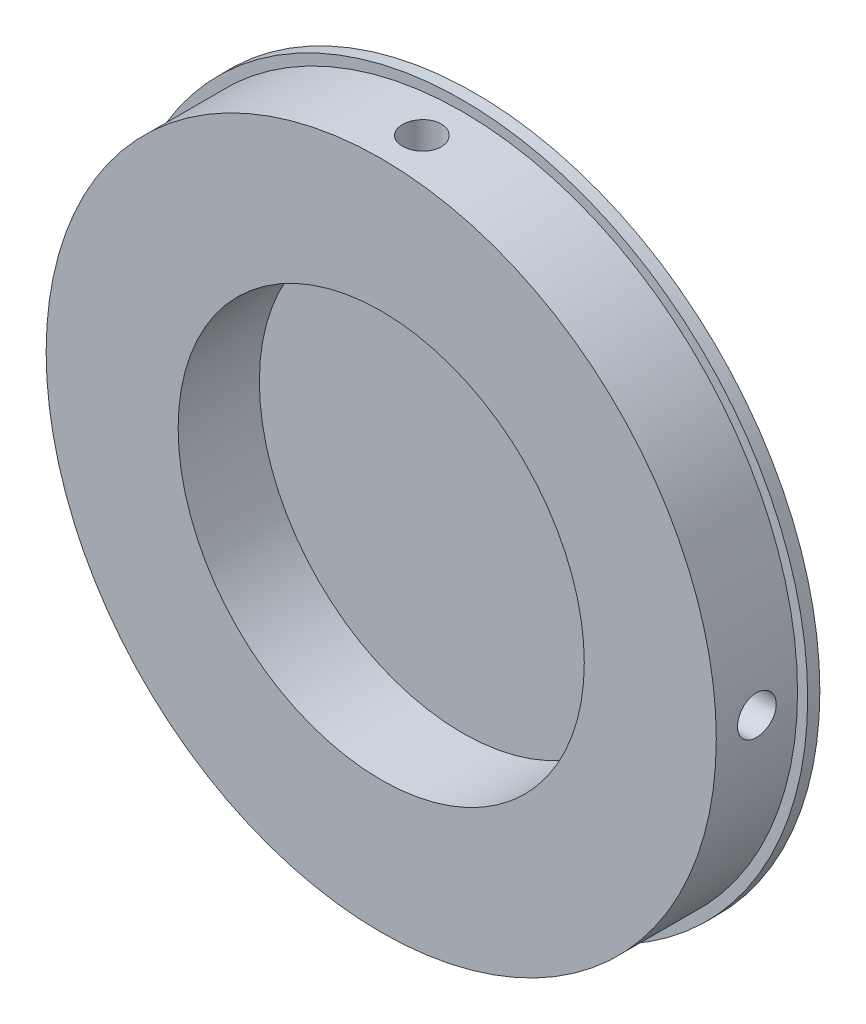
ISO-10303-21;
HEADER;
FILE_DESCRIPTION(('STEP AP214'),'2;1');
FILE_NAME('part.step','',(''),(''),'','','');
FILE_SCHEMA(('AUTOMOTIVE_DESIGN { 1 0 10303 214 1 1 1 1 }'));
ENDSEC;
DATA;
#1=APPLICATION_CONTEXT('core data for automotive mechanical design processes');
#2=APPLICATION_PROTOCOL_DEFINITION('international standard','automotive_design',2000,#1);
#3=PRODUCT_CONTEXT('',#1,'mechanical');
#4=PRODUCT('Part','Part','',(#3));
#5=PRODUCT_RELATED_PRODUCT_CATEGORY('part','',(#4));
#6=PRODUCT_DEFINITION_FORMATION('','',#4);
#7=PRODUCT_DEFINITION_CONTEXT('part definition',#1,'design');
#8=PRODUCT_DEFINITION('design','',#6,#7);
#9=PRODUCT_DEFINITION_SHAPE('','',#8);
#10=(LENGTH_UNIT() NAMED_UNIT(*) SI_UNIT(.MILLI.,.METRE.));
#11=(NAMED_UNIT(*) PLANE_ANGLE_UNIT() SI_UNIT($,.RADIAN.));
#12=(NAMED_UNIT(*) SI_UNIT($,.STERADIAN.) SOLID_ANGLE_UNIT());
#13=UNCERTAINTY_MEASURE_WITH_UNIT(LENGTH_MEASURE(1.E-05),#10,'distance_accuracy_value','');
#14=(GEOMETRIC_REPRESENTATION_CONTEXT(3) GLOBAL_UNCERTAINTY_ASSIGNED_CONTEXT((#13)) GLOBAL_UNIT_ASSIGNED_CONTEXT((#10,
#11,#12)) REPRESENTATION_CONTEXT('',''));
#15=CARTESIAN_POINT('',(0.,0.,0.));
#16=DIRECTION('',(0.,0.,1.));
#17=DIRECTION('',(1.,0.,0.));
#18=AXIS2_PLACEMENT_3D('',#15,#16,#17);
#19=CARTESIAN_POINT('',(0.,0.,23.));
#20=DIRECTION('',(0.,0.,-1.));
#21=DIRECTION('',(-1.,0.,0.));
#22=AXIS2_PLACEMENT_3D('',#19,#20,#21);
#23=CYLINDRICAL_SURFACE('',#22,82.5);
#24=CARTESIAN_POINT('',(82.5,0.,8.23750000000001));
#25=CARTESIAN_POINT('',(82.5000001710466,-0.133684294928125,8.2374989270385));
#26=CARTESIAN_POINT('',(82.4996743884226,-0.267351412059883,8.24313106765356));
#27=CARTESIAN_POINT('',(82.498380723866,-0.533778514118953,8.26561949720516));
#28=CARTESIAN_POINT('',(82.4974126779707,-0.666538258658136,8.2824786522788));
#29=CARTESIAN_POINT('',(82.4948604445486,-0.930274160935514,8.32732352695682));
#30=CARTESIAN_POINT('',(82.493275727431,-1.06124868520879,8.35531881061076));
#31=CARTESIAN_POINT('',(82.4895345059564,-1.3204161729687,8.42224672200215));
#32=CARTESIAN_POINT('',(82.4873777925748,-1.44860810104789,8.46118334834175));
#33=CARTESIAN_POINT('',(82.4825561678019,-1.70113619299289,8.54967120307317));
#34=CARTESIAN_POINT('',(82.4798917099843,-1.82547568389505,8.59921296261874));
#35=CARTESIAN_POINT('',(82.4741277121542,-2.06958227261098,8.70859810030504));
#36=CARTESIAN_POINT('',(82.4710280120698,-2.18934766747147,8.76844527037844));
#37=CARTESIAN_POINT('',(82.4644840005451,-2.42333887528703,8.89796319507606));
#38=CARTESIAN_POINT('',(82.4610398978183,-2.53756798174364,8.96762801040466));
#39=CARTESIAN_POINT('',(82.4539015520487,-2.75979802327165,9.11634151900305));
#40=CARTESIAN_POINT('',(82.4502072170394,-2.86779664118565,9.19539367047744));
#41=CARTESIAN_POINT('',(82.4426710991933,-3.07683796479633,9.36236577898451));
#42=CARTESIAN_POINT('',(82.4388292044479,-3.17787522206015,9.45029255216537));
#43=CARTESIAN_POINT('',(82.4311080535344,-3.37222314004893,9.6343740177568));
#44=CARTESIAN_POINT('',(82.4272287840897,-3.46553093290594,9.73053173743282));
#45=CARTESIAN_POINT('',(82.4195455403245,-3.64368807623651,9.93033345708952));
#46=CARTESIAN_POINT('',(82.4157415417719,-3.72854018556083,10.0339749961518));
#47=CARTESIAN_POINT('',(82.4083140138535,-3.88924887690333,10.2480782742569));
#48=CARTESIAN_POINT('',(82.4046905516244,-3.96510212675093,10.3585425167853));
#49=CARTESIAN_POINT('',(82.3977274142886,-4.10726014156348,10.5855112403982));
#50=CARTESIAN_POINT('',(82.3943878295201,-4.17356187158486,10.7020176254188));
#51=CARTESIAN_POINT('',(82.38808752036,-4.29613809763779,10.9402527551425));
#52=CARTESIAN_POINT('',(82.38512693645,-4.35240887858882,11.0619834140931));
#53=CARTESIAN_POINT('',(82.3796716583502,-4.4544716186685,11.3097276066517));
#54=CARTESIAN_POINT('',(82.377176788938,-4.50026752037841,11.435739508288));
#55=CARTESIAN_POINT('',(82.3727212133632,-4.58109296220072,11.6911930005522));
#56=CARTESIAN_POINT('',(82.3707607044769,-4.61611852670902,11.8206358385212));
#57=CARTESIAN_POINT('',(82.3657772426406,-4.70451119549415,12.2123485263395));
#58=CARTESIAN_POINT('',(82.3636398141681,-4.74142112955763,12.4785547275534));
#59=CARTESIAN_POINT('',(82.3619885494016,-4.77001200898424,13.0132478216944));
#60=CARTESIAN_POINT('',(82.3624746870722,-4.76169340318085,13.2817346919623));
#61=CARTESIAN_POINT('',(82.3660087927303,-4.70016320477401,13.8132058269929));
#62=CARTESIAN_POINT('',(82.369053692345,-4.64700538142023,14.0761962958941));
#63=CARTESIAN_POINT('',(82.3773585193614,-4.49737340952375,14.589504649058));
#64=CARTESIAN_POINT('',(82.382618458442,-4.40089903259367,14.8398224664963));
#65=CARTESIAN_POINT('',(82.3947637873595,-4.1673154923098,15.3208655625796));
#66=CARTESIAN_POINT('',(82.4016501546293,-4.03018188131259,15.5515789457523));
#67=CARTESIAN_POINT('',(82.4162713454365,-3.7191892199578,15.9867305919005));
#68=CARTESIAN_POINT('',(82.4240061770642,-3.54532981939764,16.1911686042945));
#69=CARTESIAN_POINT('',(82.4394661934344,-3.16551794864713,16.5682801441559));
#70=CARTESIAN_POINT('',(82.4471913475306,-2.95951892047617,16.7409067852094));
#71=CARTESIAN_POINT('',(82.4617505086643,-2.52143865140947,17.0491335930679));
#72=CARTESIAN_POINT('',(82.4685845154309,-2.28935740258943,17.1847337486236));
#73=CARTESIAN_POINT('',(82.4805916847322,-1.80567261951349,17.4150542788873));
#74=CARTESIAN_POINT('',(82.4857647774313,-1.55406826493299,17.5097729347322));
#75=CARTESIAN_POINT('',(82.4938661833604,-1.03849186942946,17.6556106878854));
#76=CARTESIAN_POINT('',(82.4967945189649,-0.774519951807292,17.7067302197664));
#77=CARTESIAN_POINT('',(82.5000735323367,-0.242108523461892,17.7638606641558));
#78=CARTESIAN_POINT('',(82.5004279150667,0.0263240081674112,17.769936413208));
#79=CARTESIAN_POINT('',(82.4985289341248,0.560394560649101,17.7369761414025));
#80=CARTESIAN_POINT('',(82.4962755820028,0.826032593873391,17.6979403203491));
#81=CARTESIAN_POINT('',(82.4894172395967,1.3467914103656,17.5759186864281));
#82=CARTESIAN_POINT('',(82.4848138379528,1.60191917285744,17.4929625624052));
#83=CARTESIAN_POINT('',(82.4737734504981,2.09463054485444,17.2854852038291));
#84=CARTESIAN_POINT('',(82.4673364506065,2.3322140196144,17.1609636500819));
#85=CARTESIAN_POINT('',(82.4533432599422,2.78338995773415,16.8737249587525));
#86=CARTESIAN_POINT('',(82.4457858020479,2.99695477124867,16.7109644534331));
#87=CARTESIAN_POINT('',(82.4304067102308,3.39375275622094,16.3519303000184));
#88=CARTESIAN_POINT('',(82.4225850740784,3.57698567159587,16.1556563690081));
#89=CARTESIAN_POINT('',(82.4075484684485,3.90813801387848,15.7348910184093));
#90=CARTESIAN_POINT('',(82.400334227324,4.05601542450035,15.5103665046399));
#91=CARTESIAN_POINT('',(82.3873376850466,4.31197034170699,15.0396268158764));
#92=CARTESIAN_POINT('',(82.3815553761187,4.4200480643946,14.7934117586657));
#93=CARTESIAN_POINT('',(82.3720792838418,4.5932679895823,14.2864841295943));
#94=CARTESIAN_POINT('',(82.3683842076983,4.65843677325907,14.0257806417712));
#95=CARTESIAN_POINT('',(82.3634983407347,4.74405609649354,13.4969645227343));
#96=CARTESIAN_POINT('',(82.3623075294089,4.76450700221352,13.2288519522062));
#97=CARTESIAN_POINT('',(82.362493248935,4.76125982456782,12.8274243206684));
#98=CARTESIAN_POINT('',(82.3628835458103,4.75452808388505,12.6937643963459));
#99=CARTESIAN_POINT('',(82.3643047088927,4.72985116201748,12.4275005222508));
#100=CARTESIAN_POINT('',(82.3653353382203,4.7119101274975,12.294896200341));
#101=CARTESIAN_POINT('',(82.3680094254813,4.66492958825894,12.0316337656578));
#102=CARTESIAN_POINT('',(82.3696531098882,4.63588598195092,11.9009763906948));
#103=CARTESIAN_POINT('',(82.3735054334978,4.56692408620144,11.6426213917837));
#104=CARTESIAN_POINT('',(82.3757138647018,4.5270098001258,11.5149226969854));
#105=CARTESIAN_POINT('',(82.3806342314344,4.43656995482673,11.2632978289156));
#106=CARTESIAN_POINT('',(82.3833463508694,4.38604051891694,11.1393730528745));
#107=CARTESIAN_POINT('',(82.3891954395106,4.27476036443783,10.8962665874364));
#108=CARTESIAN_POINT('',(82.3923322521748,4.21401341005907,10.7770831712181));
#109=CARTESIAN_POINT('',(82.3989437060897,4.08269486275932,10.5442143550357));
#110=CARTESIAN_POINT('',(82.4024184612354,4.01211995409191,10.4305308281339));
#111=CARTESIAN_POINT('',(82.4096051369064,3.86168963781643,10.2095486955213));
#112=CARTESIAN_POINT('',(82.4133169699415,3.78183764497421,10.1022477623176));
#113=CARTESIAN_POINT('',(82.4208804619207,3.61325241572222,9.89456408082421));
#114=CARTESIAN_POINT('',(82.4247323500972,3.52450415924912,9.79419353279118));
#115=CARTESIAN_POINT('',(82.4324592509009,3.33890442803824,9.60131954040531));
#116=CARTESIAN_POINT('',(82.4363342545064,3.24205594422467,9.50881321748823));
#117=CARTESIAN_POINT('',(82.4440013909841,3.0408508222528,9.33222683218342));
#118=CARTESIAN_POINT('',(82.4477934714704,2.93648960702237,9.24815198252806));
#119=CARTESIAN_POINT('',(82.4551834106093,2.72109074436607,9.08911941925441));
#120=CARTESIAN_POINT('',(82.4587813403836,2.61005557370154,9.01415835427129));
#121=CARTESIAN_POINT('',(82.4656876961083,2.38188924289401,8.87374500015392));
#122=CARTESIAN_POINT('',(82.46899568156,2.26474922414926,8.80830708280534));
#123=CARTESIAN_POINT('',(82.4752209249889,2.02540322712018,8.68756351161758));
#124=CARTESIAN_POINT('',(82.478138325583,1.90319911938332,8.63225415673681));
#125=CARTESIAN_POINT('',(82.4834985698215,1.65465879033114,8.53217726443998));
#126=CARTESIAN_POINT('',(82.485941823373,1.52832624951777,8.48740061417585));
#127=CARTESIAN_POINT('',(82.4902870517921,1.2723711862048,8.40865964128221));
#128=CARTESIAN_POINT('',(82.4921891657932,1.14274951873173,8.3746925391208));
#129=CARTESIAN_POINT('',(82.4958304966415,0.845866127826209,8.31014107391986));
#130=CARTESIAN_POINT('',(82.4973882432885,0.677859107368639,8.28292478016678));
#131=CARTESIAN_POINT('',(82.4994728856562,0.339892137737265,8.24660493567703));
#132=CARTESIAN_POINT('',(82.4999997825749,0.169932190833333,8.23750136389021));
#133=CARTESIAN_POINT('',(82.5,0.,8.23750000000001));
#134=B_SPLINE_CURVE_WITH_KNOTS('',3,(#24,#25,#26,#27,#28,#29,#30,#31,#32,#33,#34,#35,#36,#37,
#38,#39,#40,#41,#42,#43,#44,#45,#46,#47,#48,#49,#50,#51,#52,#53,#54,#55,#56,#57,#58,#59,#60,#61,
#62,#63,#64,#65,#66,#67,#68,#69,#70,#71,#72,#73,#74,#75,#76,#77,#78,#79,#80,#81,#82,#83,#84,#85,
#86,#87,#88,#89,#90,#91,#92,#93,#94,#95,#96,#97,#98,#99,#100,#101,#102,#103,#104,#105,#106,#107,
#108,#109,#110,#111,#112,#113,#114,#115,#116,#117,#118,#119,#120,#121,#122,#123,#124,#125,#126,
#127,#128,#129,#130,#131,#132,#133),.UNSPECIFIED.,.T.,.F.,(4,2,2,2,2,2,2,2,2,2,2,2,2,2,2,2,2,2,
2,2,2,2,2,2,2,2,2,2,2,2,2,2,2,2,2,2,2,2,2,2,2,2,2,2,2,2,2,2,2,2,2,2,2,2,4),(0.,
0.400904397878438,0.80191118163131,1.20326310848359,1.60476190383072,2.0059037031414,
2.4071934214326,2.80824140885566,3.20943759954211,3.61094430804965,4.01259932675411,
4.41412286472515,4.81579462106466,5.21759372624662,5.61954133469291,6.02133740645876,
6.42328161378043,7.22540139236237,8.02751321098022,8.82866453696684,9.62982008708939,
10.4314583374919,11.2331042323443,12.0359223753122,12.8387407621929,13.6415929002947,
14.4444370359054,15.2461253235674,16.0478100604717,16.848953572461,17.6501032368248,
18.4521659286345,19.2542353916652,20.0572533437932,20.8602669356606,21.6627826084596,
22.4652917100153,22.8663913222768,23.2673426431569,23.6684422296369,24.0693943016857,
24.470493058051,24.8714443697696,25.2725312832976,25.6734710272792,26.0750994819508,
26.4765802887277,26.8783077990637,27.2798871345309,27.682066361806,28.0840983356916,
28.4857811833331,28.8873606599453,29.3969690762361,29.9065769002728),.UNSPECIFIED.);
#135=CARTESIAN_POINT('',(82.5,0.,8.23750000000001));
#136=VERTEX_POINT('',#135);
#137=EDGE_CURVE('E46',#136,#136,#134,.T.);
#138=ORIENTED_EDGE('',*,*,#137,.T.);
#139=EDGE_LOOP('',(#138));
#140=FACE_BOUND('',#139,.T.);
#141=CARTESIAN_POINT('',(0.,0.,23.));
#142=DIRECTION('',(0.,0.,1.));
#143=DIRECTION('',(1.,0.,0.));
#144=AXIS2_PLACEMENT_3D('',#141,#142,#143);
#145=CIRCLE('',#144,82.5);
#146=CARTESIAN_POINT('',(82.5,0.,23.));
#147=VERTEX_POINT('',#146);
#148=EDGE_CURVE('E96',#147,#147,#145,.T.);
#149=ORIENTED_EDGE('',*,*,#148,.F.);
#150=EDGE_LOOP('',(#149));
#151=FACE_BOUND('',#150,.T.);
#152=CARTESIAN_POINT('',(0.,0.,3.));
#153=DIRECTION('',(0.,0.,1.));
#154=DIRECTION('',(1.,0.,0.));
#155=AXIS2_PLACEMENT_3D('',#152,#153,#154);
#156=CIRCLE('',#155,82.5);
#157=CARTESIAN_POINT('',(82.5,0.,3.));
#158=VERTEX_POINT('',#157);
#159=EDGE_CURVE('E99',#158,#158,#156,.T.);
#160=ORIENTED_EDGE('',*,*,#159,.T.);
#161=EDGE_LOOP('',(#160));
#162=FACE_BOUND('',#161,.T.);
#163=CARTESIAN_POINT('',(-4.7625,82.3624222188129,13.));
#164=CARTESIAN_POINT('',(-4.762501072982,82.3624220466945,13.133684086151));
#165=CARTESIAN_POINT('',(-4.75686894979625,82.3627483769314,13.2673509945762));
#166=CARTESIAN_POINT('',(-4.73438059152569,82.3640441680224,13.5337776736446));
#167=CARTESIAN_POINT('',(-4.71752149028083,82.3650137931044,13.6665372038956));
#168=CARTESIAN_POINT('',(-4.67267676290814,82.3675700413101,13.9302726727845));
#169=CARTESIAN_POINT('',(-4.6446815724611,82.3691571947774,14.0612469778985));
#170=CARTESIAN_POINT('',(-4.57775389109391,82.3729038707627,14.3204140228509));
#171=CARTESIAN_POINT('',(-4.53881740154535,82.37506360252,14.4486057272691));
#172=CARTESIAN_POINT('',(-4.45032987721671,82.3798915011295,14.7011333435737));
#173=CARTESIAN_POINT('',(-4.40078831405232,82.3825592140596,14.8254725834794));
#174=CARTESIAN_POINT('',(-4.29140361675645,82.3883295965517,15.0695786922234));
#175=CARTESIAN_POINT('',(-4.2315566907,82.3914324261392,15.1893438581121));
#176=CARTESIAN_POINT('',(-4.10203929123089,82.3979822157743,15.42333464969));
#177=CARTESIAN_POINT('',(-4.03237475684723,82.4014289674054,15.5375635687226));
#178=CARTESIAN_POINT('',(-3.88366183573261,82.4085718355356,15.7597932879913));
#179=CARTESIAN_POINT('',(-3.80460999080126,82.4122680437145,15.8677917710859));
#180=CARTESIAN_POINT('',(-3.63763818676022,82.4198069358348,16.0768332864262));
#181=CARTESIAN_POINT('',(-3.54971137783866,82.4236497314693,16.1778708433723));
#182=CARTESIAN_POINT('',(-3.36562977739022,82.4313715954747,16.3722193628198));
#183=CARTESIAN_POINT('',(-3.26947195857086,82.43525067672,16.4655274574506));
#184=CARTESIAN_POINT('',(-3.06966998102892,82.4429324753884,16.6436851903452));
#185=CARTESIAN_POINT('',(-2.96602828362459,82.4467352173972,16.7285375878873));
#186=CARTESIAN_POINT('',(-2.75192463052262,82.4541593055628,16.8892468324175));
#187=CARTESIAN_POINT('',(-2.64146017133289,82.4577805842414,16.9651003472464));
#188=CARTESIAN_POINT('',(-2.41449128095738,82.4647386631642,17.107258658225));
#189=CARTESIAN_POINT('',(-2.29798496237056,82.4680753736415,17.1735604457996));
#190=CARTESIAN_POINT('',(-2.05974996176148,82.4743695771217,17.2961367941131));
#191=CARTESIAN_POINT('',(-1.93801936549209,82.4773269295118,17.3524076397773));
#192=CARTESIAN_POINT('',(-1.69027530103267,82.4827757554813,17.4544705144169));
#193=CARTESIAN_POINT('',(-1.56426346467833,82.4852674042653,17.5002664856497));
#194=CARTESIAN_POINT('',(-1.30881011521559,82.4897169062259,17.581092070636));
#195=CARTESIAN_POINT('',(-1.17936735476264,82.491674562261,17.616117708761));
#196=CARTESIAN_POINT('',(-0.787654986145554,82.4966505412326,17.7045105965681));
#197=CARTESIAN_POINT('',(-0.521449054288374,82.4987843994887,17.7414206987917));
#198=CARTESIAN_POINT('',(0.0132435140513982,82.5004329535839,17.7700120075247));
#199=CARTESIAN_POINT('',(0.281730127964765,82.4999476753115,17.7616936610875));
#200=CARTESIAN_POINT('',(0.813202417107879,82.4964193238021,17.7001638695347));
#201=CARTESIAN_POINT('',(1.07619426623097,82.4933792992289,17.647005932711));
#202=CARTESIAN_POINT('',(1.58950532128994,82.4850861007083,17.4973732539409));
#203=CARTESIAN_POINT('',(1.8398244611432,82.4798329152215,17.4008982861409));
#204=CARTESIAN_POINT('',(2.32086914557514,82.467700042399,17.1673135302659));
#205=CARTESIAN_POINT('',(2.55158286237466,82.4608193825595,17.0301794336957));
#206=CARTESIAN_POINT('',(2.98673496909611,82.4462060458133,16.7191857401539));
#207=CARTESIAN_POINT('',(3.19117310822313,82.4384733607755,16.5453257926836));
#208=CARTESIAN_POINT('',(3.56828401622696,82.4230131656624,16.1655135386392));
#209=CARTESIAN_POINT('',(3.74091000951395,82.4152856795933,15.9595147845479));
#210=CARTESIAN_POINT('',(4.04913564169605,82.4007183637725,15.5214352929537));
#211=CARTESIAN_POINT('',(4.18473526803718,82.3938785343217,15.2893545466077));
#212=CARTESIAN_POINT('',(4.41505541929178,82.3818587577336,14.8056698897284));
#213=CARTESIAN_POINT('',(4.50977406019753,82.3766788870986,14.5540650800554));
#214=CARTESIAN_POINT('',(4.65561164357958,82.3685659760135,14.0384876968483));
#215=CARTESIAN_POINT('',(4.70673102332991,82.3656329130292,13.7745152473821));
#216=CARTESIAN_POINT('',(4.76386089548025,82.362348585737,13.2421035874763));
#217=CARTESIAN_POINT('',(4.76993636888256,82.3619936022688,12.973671371685));
#218=CARTESIAN_POINT('',(4.73697565855201,82.3638957528028,12.4396015174497));
#219=CARTESIAN_POINT('',(4.69793967460067,82.3661528752371,12.1739638666348));
#220=CARTESIAN_POINT('',(4.57591810051711,82.3730214641499,11.6532068721928));
#221=CARTESIAN_POINT('',(4.49296236230822,82.377631331409,11.3980805109184));
#222=CARTESIAN_POINT('',(4.28548624563452,82.3886845226781,10.9053717702326));
#223=CARTESIAN_POINT('',(4.16096554571864,82.3951278608674,10.6677895265193));
#224=CARTESIAN_POINT('',(3.87372809719335,82.4091308763189,10.2166144026915));
#225=CARTESIAN_POINT('',(3.71096776363257,82.4166918237407,10.0030493107567));
#226=CARTESIAN_POINT('',(3.35193379596618,82.4320734783217,9.60625068381295));
#227=CARTESIAN_POINT('',(3.1556598802591,82.4398941876633,9.42301740369583));
#228=CARTESIAN_POINT('',(2.73489436544766,82.4549249260856,9.09186430808432));
#229=CARTESIAN_POINT('',(2.51036967042805,82.4621342220343,8.94398651078505));
#230=CARTESIAN_POINT('',(2.0396295193975,82.4751190211247,8.68803091437782));
#231=CARTESIAN_POINT('',(1.79341418118685,82.4808945320525,8.57995289913667));
#232=CARTESIAN_POINT('',(1.2864867577029,82.4903581461651,8.40673277271448));
#233=CARTESIAN_POINT('',(1.0257837996738,82.4940475475924,8.34156395381358));
#234=CARTESIAN_POINT('',(0.496968796425633,82.4989257104748,8.25594437999324));
#235=CARTESIAN_POINT('',(0.228856811426369,82.5001144922485,8.23549326172119));
#236=CARTESIAN_POINT('',(-0.172570741550747,82.4999290947456,8.2387399834581));
#237=CARTESIAN_POINT('',(-0.306231145921063,82.4995394619749,8.24547161560983));
#238=CARTESIAN_POINT('',(-0.572495992997036,82.4981206385866,8.27014840261362));
#239=CARTESIAN_POINT('',(-0.705100807833954,82.4970916844738,8.28808941078106));
#240=CARTESIAN_POINT('',(-0.968364233971281,82.4944217784105,8.33506998251449));
#241=CARTESIAN_POINT('',(-1.09902210752696,82.4927806003123,8.36411364735594));
#242=CARTESIAN_POINT('',(-1.35737810247129,82.4889338349961,8.43307574864641));
#243=CARTESIAN_POINT('',(-1.48507729472817,82.4867284555792,8.47299018162961));
#244=CARTESIAN_POINT('',(-1.73670314794626,82.4818143966377,8.56343041155296));
#245=CARTESIAN_POINT('',(-1.86062841149005,82.479105533257,8.61396008571453));
#246=CARTESIAN_POINT('',(-2.10373581473177,82.4732627925207,8.72524080078291));
#247=CARTESIAN_POINT('',(-2.2229196812849,82.4701290717689,8.78598807742355));
#248=CARTESIAN_POINT('',(-2.45578933825936,82.4635232916916,8.9173073410858));
#249=CARTESIAN_POINT('',(-2.56947325571476,82.4600511183054,8.98788264367351));
#250=CARTESIAN_POINT('',(-2.79045609346749,82.452868804217,9.13831380441188));
#251=CARTESIAN_POINT('',(-2.89775734130914,82.4491587512999,9.21816624774109));
#252=CARTESIAN_POINT('',(-3.1054409813722,82.4415978420849,9.38675194401177));
#253=CARTESIAN_POINT('',(-3.20581121311516,82.4377467555897,9.47550016792377));
#254=CARTESIAN_POINT('',(-3.39868457173323,82.430020365301,9.66109976867555));
#255=CARTESIAN_POINT('',(-3.49119057716906,82.4261450709307,9.75794815461933));
#256=CARTESIAN_POINT('',(-3.66777634153922,82.4184762931587,9.95915301892359));
#257=CARTESIAN_POINT('',(-3.75185088738921,82.4146828614955,10.0635140746303));
#258=CARTESIAN_POINT('',(-3.91088286834864,82.4072893126934,10.2789125594262));
#259=CARTESIAN_POINT('',(-3.9858436547669,82.4036891247686,10.3899475118107));
#260=CARTESIAN_POINT('',(-4.12625669618992,82.3967775854764,10.6181136929674));
#261=CARTESIAN_POINT('',(-4.19169455129891,82.3934666744926,10.7352537976354));
#262=CARTESIAN_POINT('',(-4.31243798844562,82.3872352591601,10.9745999637857));
#263=CARTESIAN_POINT('',(-4.3677472715368,82.384314612312,11.0968041547172));
#264=CARTESIAN_POINT('',(-4.46782401181429,82.3789479212378,11.345344651988));
#265=CARTESIAN_POINT('',(-4.51260058228619,82.3765014670481,11.4716772776447));
#266=CARTESIAN_POINT('',(-4.5913413883357,82.3721502439707,11.7276325227325));
#267=CARTESIAN_POINT('',(-4.62530840352531,82.3702453358411,11.8572542871096));
#268=CARTESIAN_POINT('',(-4.68985949004956,82.3665984946763,12.1541371376482));
#269=CARTESIAN_POINT('',(-4.71707557159211,82.3650382479737,12.3221435064405));
#270=CARTESIAN_POINT('',(-4.75339513402607,82.3629502200388,12.660109170287));
#271=CARTESIAN_POINT('',(-4.76249863608688,82.3624224375998,12.8300684630584));
#272=CARTESIAN_POINT('',(-4.7625,82.3624222188129,13.));
#273=B_SPLINE_CURVE_WITH_KNOTS('',3,(#163,#164,#165,#166,#167,#168,#169,#170,#171,#172,#173,
#174,#175,#176,#177,#178,#179,#180,#181,#182,#183,#184,#185,#186,#187,#188,#189,#190,#191,#192,
#193,#194,#195,#196,#197,#198,#199,#200,#201,#202,#203,#204,#205,#206,#207,#208,#209,#210,#211,
#212,#213,#214,#215,#216,#217,#218,#219,#220,#221,#222,#223,#224,#225,#226,#227,#228,#229,#230,
#231,#232,#233,#234,#235,#236,#237,#238,#239,#240,#241,#242,#243,#244,#245,#246,#247,#248,#249,
#250,#251,#252,#253,#254,#255,#256,#257,#258,#259,#260,#261,#262,#263,#264,#265,#266,#267,#268,
#269,#270,#271,#272),.UNSPECIFIED.,.T.,.F.,(4,2,2,2,2,2,2,2,2,2,2,2,2,2,2,2,2,2,2,2,2,2,2,2,2,2,
2,2,2,2,2,2,2,2,2,2,2,2,2,2,2,2,2,2,2,2,2,2,2,2,2,2,2,2,4),(0.,0.400903770966786,
0.801909928799942,1.20326124016913,1.60475942136021,2.0059005010828,2.40718949990496,
2.80823677819255,3.20943225970539,3.6109397918383,4.01259563464974,4.41411997622547,
4.81579253558142,5.21759133726065,5.61953864196541,6.02133442250095,6.4232783394483,
7.22539734891232,8.02750842997421,8.82866368217617,9.62982311162153,10.4314624919801,
11.2331095232511,12.0359260270215,12.8387428029904,13.6415965729684,14.4444422907174,
15.2461295856434,16.0478133302144,16.8489528746599,17.6500986150243,18.4521619573108,
19.2542320393522,20.0572506546842,20.8602649091497,21.662778874481,22.4652863189801,
22.8663873468814,23.2673400832563,23.6684410732586,24.0693945458306,24.470494722247,
24.8714474517481,25.272535775154,25.6734769270017,26.0751045398275,26.4765845052742,
26.8783111907206,27.2798897036755,27.6820692821455,28.0841016067643,28.4857847882799,
28.8873645957678,29.3969710534351,29.9065769154905),.UNSPECIFIED.);
#274=CARTESIAN_POINT('',(-4.7625,82.3624222188129,13.));
#275=VERTEX_POINT('',#274);
#276=EDGE_CURVE('E50',#275,#275,#273,.T.);
#277=ORIENTED_EDGE('',*,*,#276,.F.);
#278=EDGE_LOOP('',(#277));
#279=FACE_BOUND('',#278,.T.);
#280=CARTESIAN_POINT('',(0.,-82.5,8.23750000000021));
#281=CARTESIAN_POINT('',(0.133684294928119,-82.5000001710466,8.2374989270387));
#282=CARTESIAN_POINT('',(0.267351412059871,-82.4996743884226,8.24313106765376));
#283=CARTESIAN_POINT('',(0.53377851411893,-82.498380723866,8.26561949720536));
#284=CARTESIAN_POINT('',(0.666538258658107,-82.4974126779707,8.282478652279));
#285=CARTESIAN_POINT('',(0.930274160935473,-82.4948604445486,8.32732352695701));
#286=CARTESIAN_POINT('',(1.06124868520875,-82.493275727431,8.35531881061095));
#287=CARTESIAN_POINT('',(1.32041617296864,-82.4895345059564,8.42224672200234));
#288=CARTESIAN_POINT('',(1.44860810104782,-82.4873777925748,8.46118334834193));
#289=CARTESIAN_POINT('',(1.70113619299282,-82.4825561678019,8.54967120307335));
#290=CARTESIAN_POINT('',(1.82547568389497,-82.4798917099843,8.59921296261893));
#291=CARTESIAN_POINT('',(2.06958227261089,-82.4741277121542,8.70859810030522));
#292=CARTESIAN_POINT('',(2.18934766747138,-82.4710280120698,8.76844527037862));
#293=CARTESIAN_POINT('',(2.42333887528693,-82.4644840005451,8.89796319507623));
#294=CARTESIAN_POINT('',(2.53756798174353,-82.4610398978183,8.96762801040483));
#295=CARTESIAN_POINT('',(2.75979802327153,-82.4539015520487,9.11634151900321));
#296=CARTESIAN_POINT('',(2.86779664118553,-82.4502072170394,9.1953936704776));
#297=CARTESIAN_POINT('',(3.07683796479619,-82.4426710991933,9.36236577898466));
#298=CARTESIAN_POINT('',(3.17787522206001,-82.4388292044479,9.45029255216552));
#299=CARTESIAN_POINT('',(3.37222314004878,-82.4311080535344,9.63437401775693));
#300=CARTESIAN_POINT('',(3.46553093290579,-82.4272287840897,9.73053173743295));
#301=CARTESIAN_POINT('',(3.64368807623635,-82.4195455403245,9.93033345708964));
#302=CARTESIAN_POINT('',(3.72854018556067,-82.4157415417719,10.0339749961519));
#303=CARTESIAN_POINT('',(3.88924887690316,-82.4083140138535,10.2480782742571));
#304=CARTESIAN_POINT('',(3.96510212675075,-82.4046905516244,10.3585425167855));
#305=CARTESIAN_POINT('',(4.10726014156329,-82.3977274142886,10.5855112403983));
#306=CARTESIAN_POINT('',(4.17356187158467,-82.3943878295201,10.7020176254188));
#307=CARTESIAN_POINT('',(4.29613809763759,-82.38808752036,10.9402527551426));
#308=CARTESIAN_POINT('',(4.35240887858862,-82.38512693645,11.0619834140932));
#309=CARTESIAN_POINT('',(4.4544716186683,-82.3796716583502,11.3097276066517));
#310=CARTESIAN_POINT('',(4.50026752037821,-82.377176788938,11.4357395082881));
#311=CARTESIAN_POINT('',(4.58109296220052,-82.3727212133632,11.6911930005523));
#312=CARTESIAN_POINT('',(4.61611852670882,-82.3707607044769,11.8206358385212));
#313=CARTESIAN_POINT('',(4.70451119549394,-82.3657772426406,12.2123485263395));
#314=CARTESIAN_POINT('',(4.74142112955742,-82.3636398141681,12.4785547275534));
#315=CARTESIAN_POINT('',(4.77001200898403,-82.3619885494016,13.0132478216943));
#316=CARTESIAN_POINT('',(4.76169340318064,-82.3624746870722,13.2817346919623));
#317=CARTESIAN_POINT('',(4.7001632047738,-82.3660087927303,13.8132058269929));
#318=CARTESIAN_POINT('',(4.64700538142002,-82.369053692345,14.076196295894));
#319=CARTESIAN_POINT('',(4.49737340952355,-82.3773585193614,14.5895046490579));
#320=CARTESIAN_POINT('',(4.40089903259347,-82.382618458442,14.8398224664962));
#321=CARTESIAN_POINT('',(4.16731549230961,-82.3947637873595,15.3208655625795));
#322=CARTESIAN_POINT('',(4.03018188131241,-82.4016501546293,15.5515789457522));
#323=CARTESIAN_POINT('',(3.71918921995764,-82.4162713454365,15.9867305919003));
#324=CARTESIAN_POINT('',(3.54532981939748,-82.4240061770642,16.1911686042944));
#325=CARTESIAN_POINT('',(3.16551794864698,-82.4394661934344,16.5682801441557));
#326=CARTESIAN_POINT('',(2.95951892047603,-82.4471913475306,16.7409067852092));
#327=CARTESIAN_POINT('',(2.52143865140935,-82.4617505086643,17.0491335930677));
#328=CARTESIAN_POINT('',(2.28935740258933,-82.4685845154309,17.1847337486234));
#329=CARTESIAN_POINT('',(1.8056726195134,-82.4805916847322,17.4150542788871));
#330=CARTESIAN_POINT('',(1.55406826493292,-82.4857647774313,17.509772934732));
#331=CARTESIAN_POINT('',(1.03849186942941,-82.4938661833604,17.6556106878852));
#332=CARTESIAN_POINT('',(0.774519951807254,-82.4967945189649,17.7067302197661));
#333=CARTESIAN_POINT('',(0.242108523461877,-82.5000735323367,17.7638606641555));
#334=CARTESIAN_POINT('',(-0.0263240081674145,-82.5004279150667,17.7699364132078));
#335=CARTESIAN_POINT('',(-0.560394560649081,-82.4985289341248,17.7369761414023));
#336=CARTESIAN_POINT('',(-0.826032593873358,-82.4962755820028,17.6979403203489));
#337=CARTESIAN_POINT('',(-1.34679141036555,-82.4894172395967,17.5759186864279));
#338=CARTESIAN_POINT('',(-1.60191917285737,-82.4848138379528,17.492962562405));
#339=CARTESIAN_POINT('',(-2.09463054485435,-82.4737734504981,17.2854852038289));
#340=CARTESIAN_POINT('',(-2.3322140196143,-82.4673364506065,17.1609636500816));
#341=CARTESIAN_POINT('',(-2.78338995773402,-82.4533432599422,16.8737249587523));
#342=CARTESIAN_POINT('',(-2.99695477124853,-82.4457858020479,16.7109644534329));
#343=CARTESIAN_POINT('',(-3.39375275622078,-82.4304067102308,16.3519303000183));
#344=CARTESIAN_POINT('',(-3.57698567159572,-82.4225850740784,16.1556563690079));
#345=CARTESIAN_POINT('',(-3.90813801387831,-82.4075484684485,15.7348910184092));
#346=CARTESIAN_POINT('',(-4.05601542450017,-82.400334227324,15.5103665046398));
#347=CARTESIAN_POINT('',(-4.3119703417068,-82.3873376850466,15.0396268158762));
#348=CARTESIAN_POINT('',(-4.4200480643944,-82.3815553761188,14.7934117586656));
#349=CARTESIAN_POINT('',(-4.59326798958209,-82.3720792838418,14.2864841295942));
#350=CARTESIAN_POINT('',(-4.65843677325886,-82.3683842076983,14.0257806417712));
#351=CARTESIAN_POINT('',(-4.74405609649333,-82.3634983407347,13.4969645227342));
#352=CARTESIAN_POINT('',(-4.76450700221331,-82.3623075294089,13.2288519522062));
#353=CARTESIAN_POINT('',(-4.76125982456761,-82.362493248935,12.8274243206683));
#354=CARTESIAN_POINT('',(-4.75452808388483,-82.3628835458103,12.6937643963459));
#355=CARTESIAN_POINT('',(-4.72985116201726,-82.3643047088928,12.4275005222508));
#356=CARTESIAN_POINT('',(-4.71191012749729,-82.3653353382204,12.294896200341));
#357=CARTESIAN_POINT('',(-4.66492958825873,-82.3680094254813,12.0316337656579));
#358=CARTESIAN_POINT('',(-4.63588598195071,-82.3696531098882,11.9009763906949));
#359=CARTESIAN_POINT('',(-4.56692408620123,-82.3735054334978,11.6426213917837));
#360=CARTESIAN_POINT('',(-4.52700980012559,-82.3757138647018,11.5149226969855));
#361=CARTESIAN_POINT('',(-4.43656995482653,-82.3806342314344,11.2632978289156));
#362=CARTESIAN_POINT('',(-4.38604051891674,-82.3833463508694,11.1393730528745));
#363=CARTESIAN_POINT('',(-4.27476036443764,-82.3891954395106,10.8962665874364));
#364=CARTESIAN_POINT('',(-4.21401341005888,-82.3923322521748,10.7770831712181));
#365=CARTESIAN_POINT('',(-4.08269486275913,-82.3989437060897,10.5442143550358));
#366=CARTESIAN_POINT('',(-4.01211995409172,-82.4024184612354,10.4305308281339));
#367=CARTESIAN_POINT('',(-3.86168963781625,-82.4096051369064,10.2095486955214));
#368=CARTESIAN_POINT('',(-3.78183764497403,-82.4133169699415,10.1022477623177));
#369=CARTESIAN_POINT('',(-3.61325241572205,-82.4208804619207,9.89456408082433));
#370=CARTESIAN_POINT('',(-3.52450415924895,-82.4247323500972,9.7941935327913));
#371=CARTESIAN_POINT('',(-3.33890442803809,-82.4324592509009,9.60131954040544));
#372=CARTESIAN_POINT('',(-3.24205594422452,-82.4363342545064,9.50881321748837));
#373=CARTESIAN_POINT('',(-3.04085082225266,-82.4440013909841,9.33222683218356));
#374=CARTESIAN_POINT('',(-2.93648960702223,-82.4477934714704,9.24815198252821));
#375=CARTESIAN_POINT('',(-2.72109074436595,-82.4551834106093,9.08911941925457));
#376=CARTESIAN_POINT('',(-2.61005557370142,-82.4587813403836,9.01415835427145));
#377=CARTESIAN_POINT('',(-2.3818892428939,-82.4656876961083,8.87374500015409));
#378=CARTESIAN_POINT('',(-2.26474922414916,-82.46899568156,8.80830708280551));
#379=CARTESIAN_POINT('',(-2.02540322712009,-82.4752209249889,8.68756351161775));
#380=CARTESIAN_POINT('',(-1.90319911938323,-82.478138325583,8.63225415673698));
#381=CARTESIAN_POINT('',(-1.65465879033106,-82.4834985698215,8.53217726444016));
#382=CARTESIAN_POINT('',(-1.52832624951769,-82.485941823373,8.48740061417603));
#383=CARTESIAN_POINT('',(-1.27237118620474,-82.4902870517921,8.4086596412824));
#384=CARTESIAN_POINT('',(-1.14274951873167,-82.4921891657932,8.374692539121));
#385=CARTESIAN_POINT('',(-0.845866127826166,-82.4958304966415,8.31014107392006));
#386=CARTESIAN_POINT('',(-0.677859107368603,-82.4973882432885,8.28292478016698));
#387=CARTESIAN_POINT('',(-0.339892137737246,-82.4994728856562,8.24660493567722));
#388=CARTESIAN_POINT('',(-0.169932190833324,-82.4999997825749,8.23750136389041));
#389=CARTESIAN_POINT('',(0.,-82.5,8.23750000000021));
#390=B_SPLINE_CURVE_WITH_KNOTS('',3,(#280,#281,#282,#283,#284,#285,#286,#287,#288,#289,#290,
#291,#292,#293,#294,#295,#296,#297,#298,#299,#300,#301,#302,#303,#304,#305,#306,#307,#308,#309,
#310,#311,#312,#313,#314,#315,#316,#317,#318,#319,#320,#321,#322,#323,#324,#325,#326,#327,#328,
#329,#330,#331,#332,#333,#334,#335,#336,#337,#338,#339,#340,#341,#342,#343,#344,#345,#346,#347,
#348,#349,#350,#351,#352,#353,#354,#355,#356,#357,#358,#359,#360,#361,#362,#363,#364,#365,#366,
#367,#368,#369,#370,#371,#372,#373,#374,#375,#376,#377,#378,#379,#380,#381,#382,#383,#384,#385,
#386,#387,#388,#389),.UNSPECIFIED.,.T.,.F.,(4,2,2,2,2,2,2,2,2,2,2,2,2,2,2,2,2,2,2,2,2,2,2,2,2,2,
2,2,2,2,2,2,2,2,2,2,2,2,2,2,2,2,2,2,2,2,2,2,2,2,2,2,2,2,4),(0.,0.400904397878421,
0.801911181631274,1.20326310848354,1.60476190383065,2.00590370314131,2.4071934214325,
2.80824140885554,3.20943759954197,3.61094430804949,4.01259932675393,4.41412286472495,
4.81579462106444,5.21759372624638,5.61954133469266,6.02133740645849,6.42328161378015,
7.22540139236204,8.02751321097986,8.82866453696645,9.62982008708896,10.4314583374915,
11.2331042323438,12.0359223753117,12.8387407621923,13.6415929002941,14.4444370359047,
15.2461253235667,16.0478100604709,16.8489535724602,17.650103236824,18.4521659286336,
19.2542353916644,20.0572533437923,20.8602669356597,21.6627826084587,22.4652917100143,
22.8663913222757,23.2673426431558,23.6684422296359,24.0693943016846,24.4704930580499,
24.8714443697685,25.2725312832965,25.673471027278,26.0750994819497,26.4765802887265,
26.8783077990625,27.2798871345297,27.6820663618047,28.0840983356904,28.4857811833318,
28.887360659944,29.3969690762348,29.9065769002714),.UNSPECIFIED.);
#391=CARTESIAN_POINT('',(0.,-82.5,8.23750000000021));
#392=VERTEX_POINT('',#391);
#393=EDGE_CURVE('E42',#392,#392,#390,.T.);
#394=ORIENTED_EDGE('',*,*,#393,.F.);
#395=EDGE_LOOP('',(#394));
#396=FACE_BOUND('',#395,.T.);
#397=CARTESIAN_POINT('',(-82.5,0.,17.7625));
#398=CARTESIAN_POINT('',(-82.5000001710466,0.133684294928125,17.7625010729615));
#399=CARTESIAN_POINT('',(-82.4996743884226,0.267351412059883,17.7568689323465));
#400=CARTESIAN_POINT('',(-82.498380723866,0.533778514118953,17.7343805027949));
#401=CARTESIAN_POINT('',(-82.4974126779707,0.666538258658136,17.7175213477212));
#402=CARTESIAN_POINT('',(-82.4948604445486,0.930274160935513,17.6726764730432));
#403=CARTESIAN_POINT('',(-82.493275727431,1.06124868520879,17.6446811893893));
#404=CARTESIAN_POINT('',(-82.4895345059564,1.3204161729687,17.5777532779979));
#405=CARTESIAN_POINT('',(-82.4873777925748,1.44860810104789,17.5388166516583));
#406=CARTESIAN_POINT('',(-82.4825561678019,1.70113619299289,17.4503287969269));
#407=CARTESIAN_POINT('',(-82.4798917099843,1.82547568389505,17.4007870373813));
#408=CARTESIAN_POINT('',(-82.4741277121542,2.06958227261099,17.291401899695));
#409=CARTESIAN_POINT('',(-82.4710280120698,2.18934766747147,17.2315547296216));
#410=CARTESIAN_POINT('',(-82.4644840005451,2.42333887528704,17.102036804924));
#411=CARTESIAN_POINT('',(-82.4610398978183,2.53756798174364,17.0323719895954));
#412=CARTESIAN_POINT('',(-82.4539015520487,2.75979802327165,16.883658480997));
#413=CARTESIAN_POINT('',(-82.4502072170394,2.86779664118566,16.8046063295226));
#414=CARTESIAN_POINT('',(-82.4426710991933,3.07683796479633,16.6376342210155));
#415=CARTESIAN_POINT('',(-82.4388292044479,3.17787522206015,16.5497074478346));
#416=CARTESIAN_POINT('',(-82.4311080535344,3.37222314004893,16.3656259822432));
#417=CARTESIAN_POINT('',(-82.4272287840897,3.46553093290594,16.2694682625672));
#418=CARTESIAN_POINT('',(-82.4195455403245,3.64368807623651,16.0696665429105));
#419=CARTESIAN_POINT('',(-82.4157415417719,3.72854018556083,15.9660250038483));
#420=CARTESIAN_POINT('',(-82.4083140138535,3.88924887690333,15.7519217257431));
#421=CARTESIAN_POINT('',(-82.4046905516244,3.96510212675093,15.6414574832147));
#422=CARTESIAN_POINT('',(-82.3977274142886,4.10726014156347,15.4144887596018));
#423=CARTESIAN_POINT('',(-82.3943878295201,4.17356187158485,15.2979823745813));
#424=CARTESIAN_POINT('',(-82.38808752036,4.29613809763779,15.0597472448575));
#425=CARTESIAN_POINT('',(-82.38512693645,4.35240887858882,14.9380165859069));
#426=CARTESIAN_POINT('',(-82.3796716583502,4.4544716186685,14.6902723933484));
#427=CARTESIAN_POINT('',(-82.377176788938,4.50026752037841,14.564260491712));
#428=CARTESIAN_POINT('',(-82.3727212133632,4.58109296220072,14.3088069994478));
#429=CARTESIAN_POINT('',(-82.3707607044769,4.61611852670902,14.1793641614788));
#430=CARTESIAN_POINT('',(-82.3657772426406,4.70451119549415,13.7876514736605));
#431=CARTESIAN_POINT('',(-82.3636398141681,4.74142112955763,13.5214452724466));
#432=CARTESIAN_POINT('',(-82.3619885494016,4.77001200898424,12.9867521783057));
#433=CARTESIAN_POINT('',(-82.3624746870722,4.76169340318085,12.7182653080377));
#434=CARTESIAN_POINT('',(-82.3660087927303,4.70016320477401,12.1867941730071));
#435=CARTESIAN_POINT('',(-82.369053692345,4.64700538142022,11.9238037041059));
#436=CARTESIAN_POINT('',(-82.3773585193614,4.49737340952375,11.410495350942));
#437=CARTESIAN_POINT('',(-82.382618458442,4.40089903259367,11.1601775335037));
#438=CARTESIAN_POINT('',(-82.3947637873595,4.16731549230979,10.6791344374204));
#439=CARTESIAN_POINT('',(-82.4016501546293,4.03018188131259,10.4484210542477));
#440=CARTESIAN_POINT('',(-82.4162713454365,3.7191892199578,10.0132694080995));
#441=CARTESIAN_POINT('',(-82.4240061770642,3.54532981939764,9.80883139570551));
#442=CARTESIAN_POINT('',(-82.4394661934344,3.16551794864712,9.43171985584412));
#443=CARTESIAN_POINT('',(-82.4471913475306,2.95951892047616,9.25909321479065));
#444=CARTESIAN_POINT('',(-82.4617505086643,2.52143865140947,8.95086640693211));
#445=CARTESIAN_POINT('',(-82.4685845154309,2.28935740258943,8.81526625137645));
#446=CARTESIAN_POINT('',(-82.4805916847322,1.80567261951349,8.58494572111274));
#447=CARTESIAN_POINT('',(-82.4857647774313,1.55406826493299,8.49022706526783));
#448=CARTESIAN_POINT('',(-82.4938661833604,1.03849186942945,8.34438931211458));
#449=CARTESIAN_POINT('',(-82.4967945189649,0.774519951807289,8.29326978023365));
#450=CARTESIAN_POINT('',(-82.5000735323367,0.242108523461889,8.23613933584426));
#451=CARTESIAN_POINT('',(-82.5004279150667,-0.026324008167414,8.23006358679199));
#452=CARTESIAN_POINT('',(-82.4985289341248,-0.560394560649104,8.26302385859754));
#453=CARTESIAN_POINT('',(-82.4962755820028,-0.826032593873393,8.30205967965091));
#454=CARTESIAN_POINT('',(-82.4894172395967,-1.34679141036561,8.42408131357194));
#455=CARTESIAN_POINT('',(-82.4848138379528,-1.60191917285744,8.50703743759481));
#456=CARTESIAN_POINT('',(-82.4737734504981,-2.09463054485444,8.71451479617092));
#457=CARTESIAN_POINT('',(-82.4673364506065,-2.3322140196144,8.83903634991817));
#458=CARTESIAN_POINT('',(-82.4533432599422,-2.78338995773415,9.12627504124754));
#459=CARTESIAN_POINT('',(-82.4457858020479,-2.99695477124867,9.28903554656689));
#460=CARTESIAN_POINT('',(-82.4304067102308,-3.39375275622094,9.64806969998157));
#461=CARTESIAN_POINT('',(-82.4225850740784,-3.57698567159588,9.84434363099193));
#462=CARTESIAN_POINT('',(-82.4075484684485,-3.90813801387849,10.2651089815907));
#463=CARTESIAN_POINT('',(-82.400334227324,-4.05601542450035,10.4896334953601));
#464=CARTESIAN_POINT('',(-82.3873376850466,-4.31197034170699,10.9603731841237));
#465=CARTESIAN_POINT('',(-82.3815553761187,-4.4200480643946,11.2065882413343));
#466=CARTESIAN_POINT('',(-82.3720792838418,-4.5932679895823,11.7135158704057));
#467=CARTESIAN_POINT('',(-82.3683842076983,-4.65843677325907,11.9742193582288));
#468=CARTESIAN_POINT('',(-82.3634983407347,-4.74405609649354,12.5030354772657));
#469=CARTESIAN_POINT('',(-82.3623075294089,-4.76450700221352,12.7711480477938));
#470=CARTESIAN_POINT('',(-82.362493248935,-4.76125982456782,13.1725756793317));
#471=CARTESIAN_POINT('',(-82.3628835458103,-4.75452808388505,13.3062356036541));
#472=CARTESIAN_POINT('',(-82.3643047088927,-4.72985116201748,13.5724994777493));
#473=CARTESIAN_POINT('',(-82.3653353382203,-4.7119101274975,13.705103799659));
#474=CARTESIAN_POINT('',(-82.3680094254813,-4.66492958825894,13.9683662343422));
#475=CARTESIAN_POINT('',(-82.3696531098882,-4.63588598195092,14.0990236093052));
#476=CARTESIAN_POINT('',(-82.3735054334978,-4.56692408620144,14.3573786082163));
#477=CARTESIAN_POINT('',(-82.3757138647018,-4.5270098001258,14.4850773030146));
#478=CARTESIAN_POINT('',(-82.3806342314344,-4.43656995482673,14.7367021710844));
#479=CARTESIAN_POINT('',(-82.3833463508694,-4.38604051891694,14.8606269471256));
#480=CARTESIAN_POINT('',(-82.3891954395106,-4.27476036443784,15.1037334125637));
#481=CARTESIAN_POINT('',(-82.3923322521748,-4.21401341005908,15.222916828782));
#482=CARTESIAN_POINT('',(-82.3989437060897,-4.08269486275932,15.4557856449644));
#483=CARTESIAN_POINT('',(-82.4024184612354,-4.01211995409191,15.5694691718662));
#484=CARTESIAN_POINT('',(-82.4096051369064,-3.86168963781643,15.7904513044787));
#485=CARTESIAN_POINT('',(-82.4133169699415,-3.78183764497421,15.8977522376824));
#486=CARTESIAN_POINT('',(-82.4208804619207,-3.61325241572222,16.1054359191758));
#487=CARTESIAN_POINT('',(-82.4247323500972,-3.52450415924912,16.2058064672088));
#488=CARTESIAN_POINT('',(-82.4324592509009,-3.33890442803824,16.3986804595947));
#489=CARTESIAN_POINT('',(-82.4363342545064,-3.24205594422467,16.4911867825118));
#490=CARTESIAN_POINT('',(-82.4440013909841,-3.0408508222528,16.6677731678166));
#491=CARTESIAN_POINT('',(-82.4477934714704,-2.93648960702237,16.751848017472));
#492=CARTESIAN_POINT('',(-82.4551834106093,-2.72109074436608,16.9108805807456));
#493=CARTESIAN_POINT('',(-82.4587813403836,-2.61005557370155,16.9858416457287));
#494=CARTESIAN_POINT('',(-82.4656876961083,-2.38188924289402,17.1262549998461));
#495=CARTESIAN_POINT('',(-82.46899568156,-2.26474922414927,17.1916929171947));
#496=CARTESIAN_POINT('',(-82.4752209249889,-2.02540322712018,17.3124364883824));
#497=CARTESIAN_POINT('',(-82.478138325583,-1.90319911938332,17.3677458432632));
#498=CARTESIAN_POINT('',(-82.4834985698215,-1.65465879033114,17.46782273556));
#499=CARTESIAN_POINT('',(-82.485941823373,-1.52832624951777,17.5125993858242));
#500=CARTESIAN_POINT('',(-82.4902870517921,-1.2723711862048,17.5913403587178));
#501=CARTESIAN_POINT('',(-82.4921891657932,-1.14274951873173,17.6253074608792));
#502=CARTESIAN_POINT('',(-82.4958304966415,-0.845866127826209,17.6898589260802));
#503=CARTESIAN_POINT('',(-82.4973882432885,-0.677859107368639,17.7170752198332));
#504=CARTESIAN_POINT('',(-82.4994728856562,-0.339892137737265,17.753395064323));
#505=CARTESIAN_POINT('',(-82.4999997825749,-0.169932190833333,17.7624986361098));
#506=CARTESIAN_POINT('',(-82.5,0.,17.7625));
#507=B_SPLINE_CURVE_WITH_KNOTS('',3,(#397,#398,#399,#400,#401,#402,#403,#404,#405,#406,#407,
#408,#409,#410,#411,#412,#413,#414,#415,#416,#417,#418,#419,#420,#421,#422,#423,#424,#425,#426,
#427,#428,#429,#430,#431,#432,#433,#434,#435,#436,#437,#438,#439,#440,#441,#442,#443,#444,#445,
#446,#447,#448,#449,#450,#451,#452,#453,#454,#455,#456,#457,#458,#459,#460,#461,#462,#463,#464,
#465,#466,#467,#468,#469,#470,#471,#472,#473,#474,#475,#476,#477,#478,#479,#480,#481,#482,#483,
#484,#485,#486,#487,#488,#489,#490,#491,#492,#493,#494,#495,#496,#497,#498,#499,#500,#501,#502,
#503,#504,#505,#506),.UNSPECIFIED.,.T.,.F.,(4,2,2,2,2,2,2,2,2,2,2,2,2,2,2,2,2,2,2,2,2,2,2,2,2,2,
2,2,2,2,2,2,2,2,2,2,2,2,2,2,2,2,2,2,2,2,2,2,2,2,2,2,2,2,4),(0.,0.400904397878438,
0.801911181631309,1.20326310848359,1.60476190383072,2.0059037031414,2.40719342143261,
2.80824140885566,3.20943759954211,3.61094430804965,4.0125993267541,4.41412286472514,
4.81579462106466,5.21759372624661,5.61954133469291,6.02133740645876,6.42328161378043,
7.22540139236237,8.02751321098022,8.82866453696684,9.62982008708939,10.4314583374919,
11.2331042323443,12.0359223753122,12.8387407621929,13.6415929002947,14.4444370359054,
15.2461253235674,16.0478100604717,16.848953572461,17.6501032368248,18.4521659286345,
19.2542353916652,20.0572533437932,20.8602669356606,21.6627826084596,22.4652917100153,
22.8663913222768,23.2673426431569,23.6684422296369,24.0693943016857,24.470493058051,
24.8714443697696,25.2725312832976,25.6734710272792,26.0750994819508,26.4765802887277,
26.8783077990637,27.2798871345309,27.682066361806,28.0840983356916,28.4857811833331,
28.8873606599453,29.3969690762361,29.9065769002728),.UNSPECIFIED.);
#508=CARTESIAN_POINT('',(-82.5,0.,17.7625));
#509=VERTEX_POINT('',#508);
#510=EDGE_CURVE('E10',#509,#509,#507,.T.);
#511=ORIENTED_EDGE('',*,*,#510,.F.);
#512=EDGE_LOOP('',(#511));
#513=FACE_BOUND('',#512,.T.);
#514=ADVANCED_FACE('F31',(#140,#151,#162,#279,#396,#513),#23,.T.);
#515=CARTESIAN_POINT('',(0.,0.,3.));
#516=DIRECTION('',(0.,0.,-1.));
#517=DIRECTION('',(-1.,0.,0.));
#518=AXIS2_PLACEMENT_3D('',#515,#516,#517);
#519=CYLINDRICAL_SURFACE('',#518,85.);
#520=CARTESIAN_POINT('',(0.,0.,3.));
#521=DIRECTION('',(0.,0.,1.));
#522=DIRECTION('',(1.,0.,0.));
#523=AXIS2_PLACEMENT_3D('',#520,#521,#522);
#524=CIRCLE('',#523,85.);
#525=CARTESIAN_POINT('',(85.,0.,3.));
#526=VERTEX_POINT('',#525);
#527=EDGE_CURVE('E92',#526,#526,#524,.T.);
#528=ORIENTED_EDGE('',*,*,#527,.F.);
#529=EDGE_LOOP('',(#528));
#530=FACE_BOUND('',#529,.T.);
#531=CARTESIAN_POINT('',(0.,0.,0.));
#532=DIRECTION('',(0.,0.,1.));
#533=DIRECTION('',(1.,0.,0.));
#534=AXIS2_PLACEMENT_3D('',#531,#532,#533);
#535=CIRCLE('',#534,85.);
#536=CARTESIAN_POINT('',(85.,0.,0.));
#537=VERTEX_POINT('',#536);
#538=EDGE_CURVE('E93',#537,#537,#535,.T.);
#539=ORIENTED_EDGE('',*,*,#538,.T.);
#540=EDGE_LOOP('',(#539));
#541=FACE_BOUND('',#540,.T.);
#542=ADVANCED_FACE('F33',(#530,#541),#519,.T.);
#543=CARTESIAN_POINT('',(0.,0.,3.));
#544=DIRECTION('',(0.,0.,1.));
#545=DIRECTION('',(1.,0.,0.));
#546=AXIS2_PLACEMENT_3D('',#543,#544,#545);
#547=PLANE('',#546);
#548=ORIENTED_EDGE('',*,*,#159,.F.);
#549=EDGE_LOOP('',(#548));
#550=FACE_BOUND('',#549,.T.);
#551=ORIENTED_EDGE('',*,*,#527,.T.);
#552=EDGE_LOOP('',(#551));
#553=FACE_BOUND('',#552,.T.);
#554=ADVANCED_FACE('F136',(#550,#553),#547,.T.);
#555=CARTESIAN_POINT('',(0.,0.,0.));
#556=DIRECTION('',(0.,0.,1.));
#557=DIRECTION('',(1.,0.,0.));
#558=AXIS2_PLACEMENT_3D('',#555,#556,#557);
#559=PLANE('',#558);
#560=ORIENTED_EDGE('',*,*,#538,.F.);
#561=EDGE_LOOP('',(#560));
#562=FACE_BOUND('',#561,.T.);
#563=ADVANCED_FACE('F151',(#562),#559,.F.);
#564=CARTESIAN_POINT('',(0.,0.,23.));
#565=DIRECTION('',(0.,0.,1.));
#566=DIRECTION('',(1.,0.,0.));
#567=AXIS2_PLACEMENT_3D('',#564,#565,#566);
#568=PLANE('',#567);
#569=CARTESIAN_POINT('',(0.,0.,23.));
#570=DIRECTION('',(0.,0.,1.));
#571=DIRECTION('',(1.,0.,0.));
#572=AXIS2_PLACEMENT_3D('',#569,#570,#571);
#573=CIRCLE('',#572,50.);
#574=CARTESIAN_POINT('',(50.,0.,23.));
#575=VERTEX_POINT('',#574);
#576=EDGE_CURVE('E105',#575,#575,#573,.T.);
#577=ORIENTED_EDGE('',*,*,#576,.F.);
#578=EDGE_LOOP('',(#577));
#579=FACE_BOUND('',#578,.T.);
#580=ORIENTED_EDGE('',*,*,#148,.T.);
#581=EDGE_LOOP('',(#580));
#582=FACE_BOUND('',#581,.T.);
#583=ADVANCED_FACE('F157',(#579,#582),#568,.T.);
#584=CARTESIAN_POINT('',(0.,0.,3.));
#585=DIRECTION('',(0.,0.,1.));
#586=DIRECTION('',(1.,0.,0.));
#587=AXIS2_PLACEMENT_3D('',#584,#585,#586);
#588=CYLINDRICAL_SURFACE('',#587,50.);
#589=CARTESIAN_POINT('',(0.,0.,3.));
#590=DIRECTION('',(0.,0.,1.));
#591=DIRECTION('',(1.,0.,0.));
#592=AXIS2_PLACEMENT_3D('',#589,#590,#591);
#593=CIRCLE('',#592,50.);
#594=CARTESIAN_POINT('',(50.,0.,3.));
#595=VERTEX_POINT('',#594);
#596=EDGE_CURVE('E102',#595,#595,#593,.T.);
#597=ORIENTED_EDGE('',*,*,#596,.F.);
#598=EDGE_LOOP('',(#597));
#599=FACE_BOUND('',#598,.T.);
#600=ORIENTED_EDGE('',*,*,#576,.T.);
#601=EDGE_LOOP('',(#600));
#602=FACE_BOUND('',#601,.T.);
#603=ADVANCED_FACE('F161',(#599,#602),#588,.F.);
#604=CARTESIAN_POINT('',(0.,0.,3.));
#605=DIRECTION('',(0.,0.,1.));
#606=DIRECTION('',(1.,0.,0.));
#607=AXIS2_PLACEMENT_3D('',#604,#605,#606);
#608=PLANE('',#607);
#609=ORIENTED_EDGE('',*,*,#596,.T.);
#610=EDGE_LOOP('',(#609));
#611=FACE_BOUND('',#610,.T.);
#612=ADVANCED_FACE('F85',(#611),#608,.T.);
#613=CARTESIAN_POINT('',(-1.34250085809071E-13,63.45,13.));
#614=DIRECTION('',(0.,1.,0.));
#615=DIRECTION('',(-1.,0.,0.));
#616=AXIS2_PLACEMENT_3D('',#613,#614,#615);
#617=CYLINDRICAL_SURFACE('',#616,4.7625);
#618=CARTESIAN_POINT('',(-1.34250085809071E-13,63.45,13.));
#619=DIRECTION('',(0.,-1.,0.));
#620=DIRECTION('',(1.,0.,0.));
#621=AXIS2_PLACEMENT_3D('',#618,#619,#620);
#622=CIRCLE('',#621,4.7625);
#623=CARTESIAN_POINT('',(4.76249999999987,63.45,13.));
#624=VERTEX_POINT('',#623);
#625=EDGE_CURVE('E108',#624,#624,#622,.T.);
#626=ORIENTED_EDGE('',*,*,#625,.T.);
#627=EDGE_LOOP('',(#626));
#628=FACE_BOUND('',#627,.T.);
#629=ORIENTED_EDGE('',*,*,#276,.T.);
#630=EDGE_LOOP('',(#629));
#631=FACE_BOUND('',#630,.T.);
#632=ADVANCED_FACE('F80',(#628,#631),#617,.F.);
#633=CARTESIAN_POINT('',(-1.34250085809071E-13,63.45,13.));
#634=DIRECTION('',(0.,-1.,0.));
#635=DIRECTION('',(1.,0.,0.));
#636=AXIS2_PLACEMENT_3D('',#633,#634,#635);
#637=PLANE('',#636);
#638=ORIENTED_EDGE('',*,*,#625,.F.);
#639=EDGE_LOOP('',(#638));
#640=FACE_BOUND('',#639,.T.);
#641=ADVANCED_FACE('F76',(#640),#637,.F.);
#642=CARTESIAN_POINT('',(63.45,0.,13.));
#643=DIRECTION('',(1.,0.,0.));
#644=DIRECTION('',(0.,0.,-1.));
#645=AXIS2_PLACEMENT_3D('',#642,#643,#644);
#646=CYLINDRICAL_SURFACE('',#645,4.7625);
#647=CARTESIAN_POINT('',(63.45,0.,13.));
#648=DIRECTION('',(1.,0.,0.));
#649=DIRECTION('',(0.,0.,-1.));
#650=AXIS2_PLACEMENT_3D('',#647,#648,#649);
#651=CIRCLE('',#650,4.7625);
#652=CARTESIAN_POINT('',(63.45,0.,8.23750000000001));
#653=VERTEX_POINT('',#652);
#654=EDGE_CURVE('E113',#653,#653,#651,.T.);
#655=ORIENTED_EDGE('',*,*,#654,.F.);
#656=EDGE_LOOP('',(#655));
#657=FACE_BOUND('',#656,.T.);
#658=ORIENTED_EDGE('',*,*,#137,.F.);
#659=EDGE_LOOP('',(#658));
#660=FACE_BOUND('',#659,.T.);
#661=ADVANCED_FACE('F71',(#657,#660),#646,.F.);
#662=CARTESIAN_POINT('',(63.45,0.,13.));
#663=DIRECTION('',(1.,0.,0.));
#664=DIRECTION('',(0.,0.,-1.));
#665=AXIS2_PLACEMENT_3D('',#662,#663,#664);
#666=PLANE('',#665);
#667=ORIENTED_EDGE('',*,*,#654,.T.);
#668=EDGE_LOOP('',(#667));
#669=FACE_BOUND('',#668,.T.);
#670=ADVANCED_FACE('F68',(#669),#666,.T.);
#671=CARTESIAN_POINT('',(0.,-63.45,13.));
#672=DIRECTION('',(0.,-1.,0.));
#673=DIRECTION('',(0.,0.,-1.));
#674=AXIS2_PLACEMENT_3D('',#671,#672,#673);
#675=CYLINDRICAL_SURFACE('',#674,4.76249999999979);
#676=CARTESIAN_POINT('',(0.,-63.45,13.));
#677=DIRECTION('',(0.,1.,0.));
#678=DIRECTION('',(0.,0.,1.));
#679=AXIS2_PLACEMENT_3D('',#676,#677,#678);
#680=CIRCLE('',#679,4.76249999999979);
#681=CARTESIAN_POINT('',(0.,-63.45,17.7624999999998));
#682=VERTEX_POINT('',#681);
#683=EDGE_CURVE('E116',#682,#682,#680,.T.);
#684=ORIENTED_EDGE('',*,*,#683,.T.);
#685=EDGE_LOOP('',(#684));
#686=FACE_BOUND('',#685,.T.);
#687=ORIENTED_EDGE('',*,*,#393,.T.);
#688=EDGE_LOOP('',(#687));
#689=FACE_BOUND('',#688,.T.);
#690=ADVANCED_FACE('F62',(#686,#689),#675,.F.);
#691=CARTESIAN_POINT('',(0.,-63.45,13.));
#692=DIRECTION('',(0.,1.,0.));
#693=DIRECTION('',(0.,0.,1.));
#694=AXIS2_PLACEMENT_3D('',#691,#692,#693);
#695=PLANE('',#694);
#696=ORIENTED_EDGE('',*,*,#683,.F.);
#697=EDGE_LOOP('',(#696));
#698=FACE_BOUND('',#697,.T.);
#699=ADVANCED_FACE('F67',(#698),#695,.F.);
#700=CARTESIAN_POINT('',(-63.45,0.,13.));
#701=DIRECTION('',(-1.,0.,0.));
#702=DIRECTION('',(0.,0.,1.));
#703=AXIS2_PLACEMENT_3D('',#700,#701,#702);
#704=CYLINDRICAL_SURFACE('',#703,4.7625);
#705=CARTESIAN_POINT('',(-63.45,0.,13.));
#706=DIRECTION('',(1.,0.,0.));
#707=DIRECTION('',(0.,0.,-1.));
#708=AXIS2_PLACEMENT_3D('',#705,#706,#707);
#709=CIRCLE('',#708,4.7625);
#710=CARTESIAN_POINT('',(-63.45,0.,8.23750000000001));
#711=VERTEX_POINT('',#710);
#712=EDGE_CURVE('E119',#711,#711,#709,.T.);
#713=ORIENTED_EDGE('',*,*,#712,.T.);
#714=EDGE_LOOP('',(#713));
#715=FACE_BOUND('',#714,.T.);
#716=ORIENTED_EDGE('',*,*,#510,.T.);
#717=EDGE_LOOP('',(#716));
#718=FACE_BOUND('',#717,.T.);
#719=ADVANCED_FACE('F123',(#715,#718),#704,.F.);
#720=CARTESIAN_POINT('',(-63.45,0.,13.));
#721=DIRECTION('',(1.,0.,0.));
#722=DIRECTION('',(0.,0.,-1.));
#723=AXIS2_PLACEMENT_3D('',#720,#721,#722);
#724=PLANE('',#723);
#725=ORIENTED_EDGE('',*,*,#712,.F.);
#726=EDGE_LOOP('',(#725));
#727=FACE_BOUND('',#726,.T.);
#728=ADVANCED_FACE('F125',(#727),#724,.F.);
#729=CLOSED_SHELL('',(#514,#542,#554,#563,#583,#603,#612,#632,#641,#661,#670,#690,#699,#719,#728));
#730=MANIFOLD_SOLID_BREP('B2',#729);
#731=ADVANCED_BREP_SHAPE_REPRESENTATION('',(#18,#730),#14);
#732=SHAPE_DEFINITION_REPRESENTATION(#9,#731);
ENDSEC;
END-ISO-10303-21;
